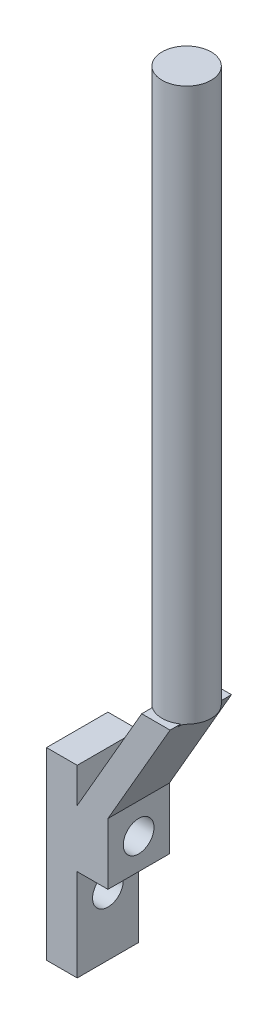
ISO-10303-21;
HEADER;
FILE_DESCRIPTION(('STEP AP214'),'2;1');
FILE_NAME('part.step','',(''),(''),'','','');
FILE_SCHEMA(('AUTOMOTIVE_DESIGN { 1 0 10303 214 1 1 1 1 }'));
ENDSEC;
DATA;
#1=APPLICATION_CONTEXT('core data for automotive mechanical design processes');
#2=APPLICATION_PROTOCOL_DEFINITION('international standard','automotive_design',2000,#1);
#3=PRODUCT_CONTEXT('',#1,'mechanical');
#4=PRODUCT('Part','Part','',(#3));
#5=PRODUCT_RELATED_PRODUCT_CATEGORY('part','',(#4));
#6=PRODUCT_DEFINITION_FORMATION('','',#4);
#7=PRODUCT_DEFINITION_CONTEXT('part definition',#1,'design');
#8=PRODUCT_DEFINITION('design','',#6,#7);
#9=PRODUCT_DEFINITION_SHAPE('','',#8);
#10=(LENGTH_UNIT() NAMED_UNIT(*) SI_UNIT(.MILLI.,.METRE.));
#11=(NAMED_UNIT(*) PLANE_ANGLE_UNIT() SI_UNIT($,.RADIAN.));
#12=(NAMED_UNIT(*) SI_UNIT($,.STERADIAN.) SOLID_ANGLE_UNIT());
#13=UNCERTAINTY_MEASURE_WITH_UNIT(LENGTH_MEASURE(1.E-05),#10,'distance_accuracy_value','');
#14=(GEOMETRIC_REPRESENTATION_CONTEXT(3) GLOBAL_UNCERTAINTY_ASSIGNED_CONTEXT((#13)) GLOBAL_UNIT_ASSIGNED_CONTEXT((#10,
#11,#12)) REPRESENTATION_CONTEXT('',''));
#15=CARTESIAN_POINT('',(0.,0.,0.));
#16=DIRECTION('',(0.,0.,1.));
#17=DIRECTION('',(1.,0.,0.));
#18=AXIS2_PLACEMENT_3D('',#15,#16,#17);
#19=CARTESIAN_POINT('',(7.81331403584307,27.5215173757844,10.));
#20=DIRECTION('',(0.,-1.,0.));
#21=DIRECTION('',(0.,0.,-1.));
#22=AXIS2_PLACEMENT_3D('',#19,#20,#21);
#23=PLANE('',#22);
#24=CARTESIAN_POINT('',(10.1227151126016,27.5215173757844,5.));
#25=DIRECTION('',(0.,1.,0.));
#26=DIRECTION('',(0.,0.,1.));
#27=AXIS2_PLACEMENT_3D('',#24,#25,#26);
#28=CIRCLE('',#27,4.);
#29=CARTESIAN_POINT('',(12.4321161893601,27.5215173757844,1.7340136762891));
#30=VERTEX_POINT('',#29);
#31=CARTESIAN_POINT('',(7.81331403584307,27.5215173757844,1.7340136762891));
#32=VERTEX_POINT('',#31);
#33=EDGE_CURVE('E163',#30,#32,#28,.T.);
#34=ORIENTED_EDGE('',*,*,#33,.F.);
#35=DIRECTION('',(0.,0.,-1.));
#36=VECTOR('',#35,1.);
#37=CARTESIAN_POINT('',(12.4321161893601,27.5215173757844,10.));
#38=LINE('',#37,#36);
#39=CARTESIAN_POINT('',(12.4321161893601,27.5215173757844,0.));
#40=VERTEX_POINT('',#39);
#41=EDGE_CURVE('E160',#30,#40,#38,.T.);
#42=ORIENTED_EDGE('',*,*,#41,.T.);
#43=DIRECTION('',(-1.,0.,0.));
#44=VECTOR('',#43,1.);
#45=CARTESIAN_POINT('',(7.81331403584307,27.5215173757844,0.));
#46=LINE('',#45,#44);
#47=CARTESIAN_POINT('',(7.81331403584307,27.5215173757844,0.));
#48=VERTEX_POINT('',#47);
#49=EDGE_CURVE('E233',#40,#48,#46,.T.);
#50=ORIENTED_EDGE('',*,*,#49,.T.);
#51=DIRECTION('',(0.,0.,-1.));
#52=VECTOR('',#51,1.);
#53=CARTESIAN_POINT('',(7.81331403584307,27.5215173757844,10.));
#54=LINE('',#53,#52);
#55=EDGE_CURVE('E239',#32,#48,#54,.T.);
#56=ORIENTED_EDGE('',*,*,#55,.F.);
#57=EDGE_LOOP('',(#34,#42,#50,#56));
#58=FACE_BOUND('',#57,.T.);
#59=ADVANCED_FACE('F33',(#58),#23,.F.);
#60=CARTESIAN_POINT('',(-2.68949008362502,9.3301270189221,10.));
#61=DIRECTION('',(-1.,0.,0.));
#62=DIRECTION('',(0.,0.,1.));
#63=AXIS2_PLACEMENT_3D('',#60,#61,#62);
#64=PLANE('',#63);
#65=DIRECTION('',(0.,1.,0.));
#66=VECTOR('',#65,1.);
#67=CARTESIAN_POINT('',(-2.68949008362502,9.3301270189221,0.));
#68=LINE('',#67,#66);
#69=CARTESIAN_POINT('',(-2.68949008362502,9.3301270189221,0.));
#70=VERTEX_POINT('',#69);
#71=CARTESIAN_POINT('',(-2.68949008362502,15.,0.));
#72=VERTEX_POINT('',#71);
#73=EDGE_CURVE('E191',#70,#72,#68,.T.);
#74=ORIENTED_EDGE('',*,*,#73,.T.);
#75=DIRECTION('',(0.,0.,-1.));
#76=VECTOR('',#75,1.);
#77=CARTESIAN_POINT('',(-2.68949008362502,15.,10.));
#78=LINE('',#77,#76);
#79=CARTESIAN_POINT('',(-2.68949008362502,15.,10.));
#80=VERTEX_POINT('',#79);
#81=EDGE_CURVE('E164',#80,#72,#78,.T.);
#82=ORIENTED_EDGE('',*,*,#81,.F.);
#83=DIRECTION('',(0.,1.,0.));
#84=VECTOR('',#83,1.);
#85=CARTESIAN_POINT('',(-2.68949008362502,9.3301270189221,10.));
#86=LINE('',#85,#84);
#87=CARTESIAN_POINT('',(-2.68949008362502,9.3301270189221,10.));
#88=VERTEX_POINT('',#87);
#89=EDGE_CURVE('E194',#88,#80,#86,.T.);
#90=ORIENTED_EDGE('',*,*,#89,.F.);
#91=DIRECTION('',(0.,0.,-1.));
#92=VECTOR('',#91,1.);
#93=CARTESIAN_POINT('',(-2.68949008362502,9.3301270189221,10.));
#94=LINE('',#93,#92);
#95=EDGE_CURVE('E215',#88,#70,#94,.T.);
#96=ORIENTED_EDGE('',*,*,#95,.T.);
#97=EDGE_LOOP('',(#74,#82,#90,#96));
#98=FACE_BOUND('',#97,.T.);
#99=ADVANCED_FACE('F285',(#98),#64,.F.);
#100=CARTESIAN_POINT('',(-7.68949008362502,15.,10.));
#101=DIRECTION('',(0.,-1.,0.));
#102=DIRECTION('',(0.,0.,-1.));
#103=AXIS2_PLACEMENT_3D('',#100,#101,#102);
#104=PLANE('',#103);
#105=DIRECTION('',(-1.,0.,0.));
#106=VECTOR('',#105,1.);
#107=CARTESIAN_POINT('',(-7.68949008362502,15.,0.));
#108=LINE('',#107,#106);
#109=CARTESIAN_POINT('',(-7.68949008362502,15.,0.));
#110=VERTEX_POINT('',#109);
#111=EDGE_CURVE('E218',#72,#110,#108,.T.);
#112=ORIENTED_EDGE('',*,*,#111,.T.);
#113=DIRECTION('',(0.,0.,-1.));
#114=VECTOR('',#113,1.);
#115=CARTESIAN_POINT('',(-7.68949008362502,15.,10.));
#116=LINE('',#115,#114);
#117=CARTESIAN_POINT('',(-7.68949008362502,15.,10.));
#118=VERTEX_POINT('',#117);
#119=EDGE_CURVE('E169',#118,#110,#116,.T.);
#120=ORIENTED_EDGE('',*,*,#119,.F.);
#121=DIRECTION('',(-1.,0.,0.));
#122=VECTOR('',#121,1.);
#123=CARTESIAN_POINT('',(-7.68949008362502,15.,10.));
#124=LINE('',#123,#122);
#125=EDGE_CURVE('E197',#80,#118,#124,.T.);
#126=ORIENTED_EDGE('',*,*,#125,.F.);
#127=ORIENTED_EDGE('',*,*,#81,.T.);
#128=EDGE_LOOP('',(#112,#120,#126,#127));
#129=FACE_BOUND('',#128,.T.);
#130=ADVANCED_FACE('F289',(#129),#104,.F.);
#131=CARTESIAN_POINT('',(-7.68949008362502,-15.,10.));
#132=DIRECTION('',(1.,0.,0.));
#133=DIRECTION('',(0.,0.,-1.));
#134=AXIS2_PLACEMENT_3D('',#131,#132,#133);
#135=PLANE('',#134);
#136=CARTESIAN_POINT('',(-7.68949008362502,-5.,5.));
#137=DIRECTION('',(-1.,0.,0.));
#138=DIRECTION('',(0.,0.,1.));
#139=AXIS2_PLACEMENT_3D('',#136,#137,#138);
#140=CIRCLE('',#139,2.5);
#141=CARTESIAN_POINT('',(-7.68949008362502,-5.,7.5));
#142=VERTEX_POINT('',#141);
#143=EDGE_CURVE('E177',#142,#142,#140,.T.);
#144=ORIENTED_EDGE('',*,*,#143,.F.);
#145=EDGE_LOOP('',(#144));
#146=FACE_BOUND('',#145,.T.);
#147=CARTESIAN_POINT('',(-7.68949008362502,5.,5.));
#148=DIRECTION('',(-1.,0.,0.));
#149=DIRECTION('',(0.,0.,1.));
#150=AXIS2_PLACEMENT_3D('',#147,#148,#149);
#151=CIRCLE('',#150,2.5);
#152=CARTESIAN_POINT('',(-7.68949008362502,5.,7.5));
#153=VERTEX_POINT('',#152);
#154=EDGE_CURVE('E185',#153,#153,#151,.T.);
#155=ORIENTED_EDGE('',*,*,#154,.F.);
#156=EDGE_LOOP('',(#155));
#157=FACE_BOUND('',#156,.T.);
#158=DIRECTION('',(0.,-1.,0.));
#159=VECTOR('',#158,1.);
#160=CARTESIAN_POINT('',(-7.68949008362502,-15.,0.));
#161=LINE('',#160,#159);
#162=CARTESIAN_POINT('',(-7.68949008362502,-15.,0.));
#163=VERTEX_POINT('',#162);
#164=EDGE_CURVE('E220',#110,#163,#161,.T.);
#165=ORIENTED_EDGE('',*,*,#164,.T.);
#166=DIRECTION('',(0.,0.,-1.));
#167=VECTOR('',#166,1.);
#168=CARTESIAN_POINT('',(-7.68949008362502,-15.,10.));
#169=LINE('',#168,#167);
#170=CARTESIAN_POINT('',(-7.68949008362502,-15.,10.));
#171=VERTEX_POINT('',#170);
#172=EDGE_CURVE('E253',#171,#163,#169,.T.);
#173=ORIENTED_EDGE('',*,*,#172,.F.);
#174=DIRECTION('',(0.,-1.,0.));
#175=VECTOR('',#174,1.);
#176=CARTESIAN_POINT('',(-7.68949008362502,-15.,10.));
#177=LINE('',#176,#175);
#178=EDGE_CURVE('E200',#118,#171,#177,.T.);
#179=ORIENTED_EDGE('',*,*,#178,.F.);
#180=ORIENTED_EDGE('',*,*,#119,.T.);
#181=EDGE_LOOP('',(#165,#173,#179,#180));
#182=FACE_BOUND('',#181,.T.);
#183=ADVANCED_FACE('F293',(#146,#157,#182),#135,.F.);
#184=CARTESIAN_POINT('',(-7.68949008362502,-15.,10.));
#185=DIRECTION('',(0.,1.,0.));
#186=DIRECTION('',(0.,0.,1.));
#187=AXIS2_PLACEMENT_3D('',#184,#185,#186);
#188=PLANE('',#187);
#189=DIRECTION('',(1.,0.,0.));
#190=VECTOR('',#189,1.);
#191=CARTESIAN_POINT('',(-7.68949008362502,-15.,0.));
#192=LINE('',#191,#190);
#193=CARTESIAN_POINT('',(-2.68949008362502,-15.,0.));
#194=VERTEX_POINT('',#193);
#195=EDGE_CURVE('E222',#163,#194,#192,.T.);
#196=ORIENTED_EDGE('',*,*,#195,.T.);
#197=DIRECTION('',(0.,0.,-1.));
#198=VECTOR('',#197,1.);
#199=CARTESIAN_POINT('',(-2.68949008362502,-15.,10.));
#200=LINE('',#199,#198);
#201=CARTESIAN_POINT('',(-2.68949008362502,-15.,10.));
#202=VERTEX_POINT('',#201);
#203=EDGE_CURVE('E250',#202,#194,#200,.T.);
#204=ORIENTED_EDGE('',*,*,#203,.F.);
#205=DIRECTION('',(1.,0.,0.));
#206=VECTOR('',#205,1.);
#207=CARTESIAN_POINT('',(-7.68949008362502,-15.,10.));
#208=LINE('',#207,#206);
#209=EDGE_CURVE('E202',#171,#202,#208,.T.);
#210=ORIENTED_EDGE('',*,*,#209,.F.);
#211=ORIENTED_EDGE('',*,*,#172,.T.);
#212=EDGE_LOOP('',(#196,#204,#210,#211));
#213=FACE_BOUND('',#212,.T.);
#214=ADVANCED_FACE('F297',(#213),#188,.F.);
#215=CARTESIAN_POINT('',(-2.68949008362502,-15.,10.));
#216=DIRECTION('',(-1.,0.,0.));
#217=DIRECTION('',(0.,-1.,0.));
#218=AXIS2_PLACEMENT_3D('',#215,#216,#217);
#219=PLANE('',#218);
#220=CARTESIAN_POINT('',(-2.68949008362502,-5.,5.));
#221=DIRECTION('',(-1.,0.,0.));
#222=DIRECTION('',(0.,-1.,0.));
#223=AXIS2_PLACEMENT_3D('',#220,#221,#222);
#224=CIRCLE('',#223,2.5);
#225=CARTESIAN_POINT('',(-2.68949008362502,-7.5,5.));
#226=VERTEX_POINT('',#225);
#227=EDGE_CURVE('E181',#226,#226,#224,.T.);
#228=ORIENTED_EDGE('',*,*,#227,.T.);
#229=EDGE_LOOP('',(#228));
#230=FACE_BOUND('',#229,.T.);
#231=DIRECTION('',(0.,1.,0.));
#232=VECTOR('',#231,1.);
#233=CARTESIAN_POINT('',(-2.68949008362502,-15.,0.));
#234=LINE('',#233,#232);
#235=CARTESIAN_POINT('',(-2.68949008362502,0.,0.));
#236=VERTEX_POINT('',#235);
#237=EDGE_CURVE('E224',#194,#236,#234,.T.);
#238=ORIENTED_EDGE('',*,*,#237,.T.);
#239=DIRECTION('',(0.,0.,-1.));
#240=VECTOR('',#239,1.);
#241=CARTESIAN_POINT('',(-2.68949008362502,0.,10.));
#242=LINE('',#241,#240);
#243=CARTESIAN_POINT('',(-2.68949008362502,0.,10.));
#244=VERTEX_POINT('',#243);
#245=EDGE_CURVE('E247',#244,#236,#242,.T.);
#246=ORIENTED_EDGE('',*,*,#245,.F.);
#247=DIRECTION('',(0.,1.,0.));
#248=VECTOR('',#247,1.);
#249=CARTESIAN_POINT('',(-2.68949008362502,-15.,10.));
#250=LINE('',#249,#248);
#251=EDGE_CURVE('E204',#202,#244,#250,.T.);
#252=ORIENTED_EDGE('',*,*,#251,.F.);
#253=ORIENTED_EDGE('',*,*,#203,.T.);
#254=EDGE_LOOP('',(#238,#246,#252,#253));
#255=FACE_BOUND('',#254,.T.);
#256=ADVANCED_FACE('F301',(#230,#255),#219,.F.);
#257=CARTESIAN_POINT('',(-2.68949008362502,0.,10.));
#258=DIRECTION('',(0.,1.,0.));
#259=DIRECTION('',(-1.,0.,0.));
#260=AXIS2_PLACEMENT_3D('',#257,#258,#259);
#261=PLANE('',#260);
#262=DIRECTION('',(1.,0.,0.));
#263=VECTOR('',#262,1.);
#264=CARTESIAN_POINT('',(-2.68949008362502,0.,0.));
#265=LINE('',#264,#263);
#266=CARTESIAN_POINT('',(2.31050991637498,0.,0.));
#267=VERTEX_POINT('',#266);
#268=EDGE_CURVE('E226',#236,#267,#265,.T.);
#269=ORIENTED_EDGE('',*,*,#268,.T.);
#270=DIRECTION('',(0.,0.,-1.));
#271=VECTOR('',#270,1.);
#272=CARTESIAN_POINT('',(2.31050991637498,0.,10.));
#273=LINE('',#272,#271);
#274=CARTESIAN_POINT('',(2.31050991637498,0.,10.));
#275=VERTEX_POINT('',#274);
#276=EDGE_CURVE('E244',#275,#267,#273,.T.);
#277=ORIENTED_EDGE('',*,*,#276,.F.);
#278=DIRECTION('',(1.,0.,0.));
#279=VECTOR('',#278,1.);
#280=CARTESIAN_POINT('',(-2.68949008362502,0.,10.));
#281=LINE('',#280,#279);
#282=EDGE_CURVE('E206',#244,#275,#281,.T.);
#283=ORIENTED_EDGE('',*,*,#282,.F.);
#284=ORIENTED_EDGE('',*,*,#245,.T.);
#285=EDGE_LOOP('',(#269,#277,#283,#284));
#286=FACE_BOUND('',#285,.T.);
#287=ADVANCED_FACE('F305',(#286),#261,.F.);
#288=CARTESIAN_POINT('',(2.31050991637498,0.,10.));
#289=DIRECTION('',(-1.,0.,0.));
#290=DIRECTION('',(0.,0.,1.));
#291=AXIS2_PLACEMENT_3D('',#288,#289,#290);
#292=PLANE('',#291);
#293=CARTESIAN_POINT('',(2.31050991637498,5.,5.));
#294=DIRECTION('',(-1.,0.,0.));
#295=DIRECTION('',(0.,0.,1.));
#296=AXIS2_PLACEMENT_3D('',#293,#294,#295);
#297=CIRCLE('',#296,2.5);
#298=CARTESIAN_POINT('',(2.31050991637498,5.,7.5));
#299=VERTEX_POINT('',#298);
#300=EDGE_CURVE('E188',#299,#299,#297,.T.);
#301=ORIENTED_EDGE('',*,*,#300,.T.);
#302=EDGE_LOOP('',(#301));
#303=FACE_BOUND('',#302,.T.);
#304=DIRECTION('',(0.,1.,0.));
#305=VECTOR('',#304,1.);
#306=CARTESIAN_POINT('',(2.31050991637498,0.,0.));
#307=LINE('',#306,#305);
#308=CARTESIAN_POINT('',(2.31050991637498,9.99038105676646,0.));
#309=VERTEX_POINT('',#308);
#310=EDGE_CURVE('E228',#267,#309,#307,.T.);
#311=ORIENTED_EDGE('',*,*,#310,.T.);
#312=DIRECTION('',(0.,0.,-1.));
#313=VECTOR('',#312,1.);
#314=CARTESIAN_POINT('',(2.31050991637498,9.99038105676646,10.));
#315=LINE('',#314,#313);
#316=CARTESIAN_POINT('',(2.31050991637498,9.99038105676646,10.));
#317=VERTEX_POINT('',#316);
#318=EDGE_CURVE('E159',#317,#309,#315,.T.);
#319=ORIENTED_EDGE('',*,*,#318,.F.);
#320=DIRECTION('',(0.,1.,0.));
#321=VECTOR('',#320,1.);
#322=CARTESIAN_POINT('',(2.31050991637498,0.,10.));
#323=LINE('',#322,#321);
#324=EDGE_CURVE('E208',#275,#317,#323,.T.);
#325=ORIENTED_EDGE('',*,*,#324,.F.);
#326=ORIENTED_EDGE('',*,*,#276,.T.);
#327=EDGE_LOOP('',(#311,#319,#325,#326));
#328=FACE_BOUND('',#327,.T.);
#329=ADVANCED_FACE('F309',(#303,#328),#292,.F.);
#330=CARTESIAN_POINT('',(2.31050991637498,9.99038105676646,10.));
#331=DIRECTION('',(-0.866025403784436,0.500000000000004,0.));
#332=DIRECTION('',(-0.500000000000004,-0.866025403784436,0.));
#333=AXIS2_PLACEMENT_3D('',#330,#331,#332);
#334=PLANE('',#333);
#335=ORIENTED_EDGE('',*,*,#41,.F.);
#336=CARTESIAN_POINT('',(10.1227151126016,23.5215173757844,5.));
#337=DIRECTION('',(-0.866025403784436,0.500000000000004,0.));
#338=DIRECTION('',(-0.500000000000004,-0.866025403784436,0.));
#339=AXIS2_PLACEMENT_3D('',#336,#337,#338);
#340=ELLIPSE('',#339,7.99999999999994,4.);
#341=CARTESIAN_POINT('',(12.1434410547653,27.0215173757844,1.54794747046534));
#342=VERTEX_POINT('',#341);
#343=EDGE_CURVE('E261',#30,#342,#340,.T.);
#344=ORIENTED_EDGE('',*,*,#343,.T.);
#345=DIRECTION('',(0.,0.,-1.));
#346=VECTOR('',#345,1.);
#347=CARTESIAN_POINT('',(12.1434410547653,27.0215173757844,8.2659863237109));
#348=LINE('',#347,#346);
#349=CARTESIAN_POINT('',(12.1434410547653,27.0215173757844,8.45205252953466));
#350=VERTEX_POINT('',#349);
#351=EDGE_CURVE('E149',#342,#350,#348,.F.);
#352=ORIENTED_EDGE('',*,*,#351,.T.);
#353=CARTESIAN_POINT('',(10.1227151126016,23.5215173757844,5.));
#354=DIRECTION('',(-0.866025403784436,0.500000000000004,0.));
#355=DIRECTION('',(-0.500000000000004,-0.866025403784436,0.));
#356=AXIS2_PLACEMENT_3D('',#353,#354,#355);
#357=ELLIPSE('',#356,7.99999999999994,4.);
#358=CARTESIAN_POINT('',(12.4321161893601,27.5215173757844,8.2659863237109));
#359=VERTEX_POINT('',#358);
#360=EDGE_CURVE('E140',#350,#359,#357,.T.);
#361=ORIENTED_EDGE('',*,*,#360,.T.);
#362=CARTESIAN_POINT('',(12.4321161893601,27.5215173757844,10.));
#363=VERTEX_POINT('',#362);
#364=EDGE_CURVE('E145',#363,#359,#38,.T.);
#365=ORIENTED_EDGE('',*,*,#364,.F.);
#366=DIRECTION('',(0.500000000000004,0.866025403784436,0.));
#367=VECTOR('',#366,1.);
#368=CARTESIAN_POINT('',(2.31050991637498,9.99038105676646,10.));
#369=LINE('',#368,#367);
#370=EDGE_CURVE('E210',#317,#363,#369,.T.);
#371=ORIENTED_EDGE('',*,*,#370,.F.);
#372=ORIENTED_EDGE('',*,*,#318,.T.);
#373=DIRECTION('',(0.500000000000004,0.866025403784436,0.));
#374=VECTOR('',#373,1.);
#375=CARTESIAN_POINT('',(2.31050991637498,9.99038105676646,0.));
#376=LINE('',#375,#374);
#377=EDGE_CURVE('E230',#309,#40,#376,.T.);
#378=ORIENTED_EDGE('',*,*,#377,.T.);
#379=EDGE_LOOP('',(#335,#344,#352,#361,#365,#371,#372,#378));
#380=FACE_BOUND('',#379,.T.);
#381=ADVANCED_FACE('F143',(#380),#334,.F.);
#382=CARTESIAN_POINT('',(7.81331403584307,27.5215173757844,8.2659863237109));
#383=VERTEX_POINT('',#382);
#384=EDGE_CURVE('E157',#383,#359,#28,.T.);
#385=ORIENTED_EDGE('',*,*,#384,.F.);
#386=CARTESIAN_POINT('',(7.81331403584307,27.5215173757844,10.));
#387=VERTEX_POINT('',#386);
#388=EDGE_CURVE('E240',#387,#383,#54,.T.);
#389=ORIENTED_EDGE('',*,*,#388,.F.);
#390=DIRECTION('',(-1.,0.,0.));
#391=VECTOR('',#390,1.);
#392=CARTESIAN_POINT('',(7.81331403584307,27.5215173757844,10.));
#393=LINE('',#392,#391);
#394=EDGE_CURVE('E158',#363,#387,#393,.T.);
#395=ORIENTED_EDGE('',*,*,#394,.F.);
#396=ORIENTED_EDGE('',*,*,#364,.T.);
#397=EDGE_LOOP('',(#385,#389,#395,#396));
#398=FACE_BOUND('',#397,.T.);
#399=ADVANCED_FACE('F155',(#398),#23,.F.);
#400=CARTESIAN_POINT('',(-2.68949008362502,9.3301270189221,10.));
#401=DIRECTION('',(0.866025403784437,-0.500000000000004,0.));
#402=DIRECTION('',(0.500000000000004,0.866025403784437,0.));
#403=AXIS2_PLACEMENT_3D('',#400,#401,#402);
#404=PLANE('',#403);
#405=DIRECTION('',(0.,0.,-1.));
#406=VECTOR('',#405,1.);
#407=CARTESIAN_POINT('',(6.94728863205862,26.0215173757844,1.7340136762891));
#408=LINE('',#407,#406);
#409=CARTESIAN_POINT('',(6.94728863205862,26.0215173757844,7.43241991988987));
#410=VERTEX_POINT('',#409);
#411=CARTESIAN_POINT('',(6.94728863205862,26.0215173757844,2.56758008011013));
#412=VERTEX_POINT('',#411);
#413=EDGE_CURVE('E264',#410,#412,#408,.T.);
#414=ORIENTED_EDGE('',*,*,#413,.T.);
#415=CARTESIAN_POINT('',(10.1227151126016,31.5215173757843,5.));
#416=DIRECTION('',(0.866025403784437,-0.500000000000004,0.));
#417=DIRECTION('',(-0.500000000000004,-0.866025403784437,0.));
#418=AXIS2_PLACEMENT_3D('',#415,#416,#417);
#419=ELLIPSE('',#418,7.99999999999994,4.);
#420=EDGE_CURVE('E267',#412,#32,#419,.T.);
#421=ORIENTED_EDGE('',*,*,#420,.T.);
#422=ORIENTED_EDGE('',*,*,#55,.T.);
#423=DIRECTION('',(-0.500000000000004,-0.866025403784436,0.));
#424=VECTOR('',#423,1.);
#425=CARTESIAN_POINT('',(-2.68949008362502,9.3301270189221,0.));
#426=LINE('',#425,#424);
#427=EDGE_CURVE('E198',#48,#70,#426,.T.);
#428=ORIENTED_EDGE('',*,*,#427,.T.);
#429=ORIENTED_EDGE('',*,*,#95,.F.);
#430=DIRECTION('',(-0.500000000000004,-0.866025403784436,0.));
#431=VECTOR('',#430,1.);
#432=CARTESIAN_POINT('',(-2.68949008362502,9.3301270189221,10.));
#433=LINE('',#432,#431);
#434=EDGE_CURVE('E213',#387,#88,#433,.T.);
#435=ORIENTED_EDGE('',*,*,#434,.F.);
#436=ORIENTED_EDGE('',*,*,#388,.T.);
#437=CARTESIAN_POINT('',(10.1227151126016,31.5215173757843,5.));
#438=DIRECTION('',(0.866025403784437,-0.500000000000004,0.));
#439=DIRECTION('',(-0.500000000000004,-0.866025403784437,0.));
#440=AXIS2_PLACEMENT_3D('',#437,#438,#439);
#441=ELLIPSE('',#440,7.99999999999994,4.);
#442=EDGE_CURVE('E53',#383,#410,#441,.T.);
#443=ORIENTED_EDGE('',*,*,#442,.T.);
#444=EDGE_LOOP('',(#414,#421,#422,#428,#429,#435,#436,#443));
#445=FACE_BOUND('',#444,.T.);
#446=ADVANCED_FACE('F318',(#445),#404,.F.);
#447=CARTESIAN_POINT('',(0.,0.,10.));
#448=DIRECTION('',(0.,0.,-1.));
#449=DIRECTION('',(-1.,0.,0.));
#450=AXIS2_PLACEMENT_3D('',#447,#448,#449);
#451=PLANE('',#450);
#452=ORIENTED_EDGE('',*,*,#89,.T.);
#453=ORIENTED_EDGE('',*,*,#125,.T.);
#454=ORIENTED_EDGE('',*,*,#178,.T.);
#455=ORIENTED_EDGE('',*,*,#209,.T.);
#456=ORIENTED_EDGE('',*,*,#251,.T.);
#457=ORIENTED_EDGE('',*,*,#282,.T.);
#458=ORIENTED_EDGE('',*,*,#324,.T.);
#459=ORIENTED_EDGE('',*,*,#370,.T.);
#460=ORIENTED_EDGE('',*,*,#394,.T.);
#461=ORIENTED_EDGE('',*,*,#434,.T.);
#462=EDGE_LOOP('',(#452,#453,#454,#455,#456,#457,#458,#459,#460,#461));
#463=FACE_BOUND('',#462,.T.);
#464=ADVANCED_FACE('F321',(#463),#451,.F.);
#465=CARTESIAN_POINT('',(0.,0.,0.));
#466=DIRECTION('',(0.,0.,-1.));
#467=DIRECTION('',(-1.,0.,0.));
#468=AXIS2_PLACEMENT_3D('',#465,#466,#467);
#469=PLANE('',#468);
#470=ORIENTED_EDGE('',*,*,#73,.F.);
#471=ORIENTED_EDGE('',*,*,#427,.F.);
#472=ORIENTED_EDGE('',*,*,#49,.F.);
#473=ORIENTED_EDGE('',*,*,#377,.F.);
#474=ORIENTED_EDGE('',*,*,#310,.F.);
#475=ORIENTED_EDGE('',*,*,#268,.F.);
#476=ORIENTED_EDGE('',*,*,#237,.F.);
#477=ORIENTED_EDGE('',*,*,#195,.F.);
#478=ORIENTED_EDGE('',*,*,#164,.F.);
#479=ORIENTED_EDGE('',*,*,#111,.F.);
#480=EDGE_LOOP('',(#470,#471,#472,#473,#474,#475,#476,#477,#478,#479));
#481=FACE_BOUND('',#480,.T.);
#482=ADVANCED_FACE('F323',(#481),#469,.T.);
#483=CARTESIAN_POINT('',(2.31050991637498,5.,5.));
#484=DIRECTION('',(-1.,0.,0.));
#485=DIRECTION('',(0.,0.,1.));
#486=AXIS2_PLACEMENT_3D('',#483,#484,#485);
#487=CYLINDRICAL_SURFACE('',#486,2.5);
#488=ORIENTED_EDGE('',*,*,#300,.F.);
#489=EDGE_LOOP('',(#488));
#490=FACE_BOUND('',#489,.T.);
#491=ORIENTED_EDGE('',*,*,#154,.T.);
#492=EDGE_LOOP('',(#491));
#493=FACE_BOUND('',#492,.T.);
#494=ADVANCED_FACE('F326',(#490,#493),#487,.F.);
#495=CARTESIAN_POINT('',(2.31050991637498,-5.,5.));
#496=DIRECTION('',(-1.,0.,0.));
#497=DIRECTION('',(0.,0.,1.));
#498=AXIS2_PLACEMENT_3D('',#495,#496,#497);
#499=CYLINDRICAL_SURFACE('',#498,2.5);
#500=ORIENTED_EDGE('',*,*,#143,.T.);
#501=EDGE_LOOP('',(#500));
#502=FACE_BOUND('',#501,.T.);
#503=ORIENTED_EDGE('',*,*,#227,.F.);
#504=EDGE_LOOP('',(#503));
#505=FACE_BOUND('',#504,.T.);
#506=ADVANCED_FACE('F332',(#502,#505),#499,.F.);
#507=CARTESIAN_POINT('',(10.1227151126016,27.5215173757844,5.));
#508=DIRECTION('',(0.,1.,0.));
#509=DIRECTION('',(0.,0.,1.));
#510=AXIS2_PLACEMENT_3D('',#507,#508,#509);
#511=PLANE('',#510);
#512=CARTESIAN_POINT('',(13.0094664585497,27.5215173757844,7.76887462097269));
#513=VERTEX_POINT('',#512);
#514=CARTESIAN_POINT('',(13.0094664585497,27.5215173757844,2.23112537902731));
#515=VERTEX_POINT('',#514);
#516=EDGE_CURVE('E166',#513,#515,#28,.T.);
#517=ORIENTED_EDGE('',*,*,#516,.F.);
#518=DIRECTION('',(0.,0.,-1.));
#519=VECTOR('',#518,1.);
#520=CARTESIAN_POINT('',(13.0094664585497,27.5215173757844,1.7340136762891));
#521=LINE('',#520,#519);
#522=EDGE_CURVE('E151',#513,#515,#521,.T.);
#523=ORIENTED_EDGE('',*,*,#522,.T.);
#524=EDGE_LOOP('',(#517,#523));
#525=FACE_BOUND('',#524,.T.);
#526=ADVANCED_FACE('F335',(#525),#511,.F.);
#527=CARTESIAN_POINT('',(10.1227151126016,117.521517375784,5.));
#528=DIRECTION('',(0.,-1.,0.));
#529=DIRECTION('',(0.,0.,-1.));
#530=AXIS2_PLACEMENT_3D('',#527,#528,#529);
#531=CYLINDRICAL_SURFACE('',#530,4.);
#532=CARTESIAN_POINT('',(10.1227151126016,117.521517375784,5.));
#533=DIRECTION('',(0.,1.,0.));
#534=DIRECTION('',(0.,0.,1.));
#535=AXIS2_PLACEMENT_3D('',#532,#533,#534);
#536=CIRCLE('',#535,4.);
#537=CARTESIAN_POINT('',(10.1227151126016,117.521517375784,9.));
#538=VERTEX_POINT('',#537);
#539=EDGE_CURVE('E174',#538,#538,#536,.T.);
#540=ORIENTED_EDGE('',*,*,#539,.F.);
#541=EDGE_LOOP('',(#540));
#542=FACE_BOUND('',#541,.T.);
#543=ORIENTED_EDGE('',*,*,#384,.T.);
#544=ORIENTED_EDGE('',*,*,#360,.F.);
#545=CARTESIAN_POINT('',(12.1434410547653,27.0215173757844,8.45205252953466));
#546=CARTESIAN_POINT('',(12.1574265091564,27.0457451607551,8.44386550689673));
#547=CARTESIAN_POINT('',(12.1723272677514,27.0692009009897,8.43502912714203));
#548=CARTESIAN_POINT('',(12.2037364178457,27.1144392553982,8.41609247570115));
#549=CARTESIAN_POINT('',(12.2202435450016,27.1362231616685,8.40599319626405));
#550=CARTESIAN_POINT('',(12.271595269201,27.1985883809706,8.37400709732685));
#551=CARTESIAN_POINT('',(12.3085049372632,27.236580964353,8.35029766804766));
#552=CARTESIAN_POINT('',(12.385830825286,27.3049338033696,8.29855483027482));
#553=CARTESIAN_POINT('',(12.4262371374088,27.3353147319496,8.27053347484389));
#554=CARTESIAN_POINT('',(12.5090859265276,27.3887285573418,8.21058565691323));
#555=CARTESIAN_POINT('',(12.5515328400224,27.4117445261696,8.17865042809074));
#556=CARTESIAN_POINT('',(12.6547959948724,27.458872341472,8.09749334791811));
#557=CARTESIAN_POINT('',(12.7159107835974,27.4794597919391,8.04660542042779));
#558=CARTESIAN_POINT('',(12.8364291130488,27.5083862502609,7.93977159268448));
#559=CARTESIAN_POINT('',(12.89583243691,27.5167237125142,7.88382505512341));
#560=CARTESIAN_POINT('',(12.9723772501075,27.5210061514354,7.80716064394308));
#561=CARTESIAN_POINT('',(12.9910259593515,27.5215159022869,7.78810505431339));
#562=CARTESIAN_POINT('',(13.0094664585497,27.5215173757844,7.76887462097269));
#563=B_SPLINE_CURVE_WITH_KNOTS('',3,(#545,#546,#547,#548,#549,#550,#551,#552,#553,#554,#555,
#556,#557,#558,#559,#560,#561,#562),.UNSPECIFIED.,.F.,.F.,(4,2,2,2,2,2,2,2,4),(0.,
0.087376227798189,0.174684231199718,0.347877843245191,0.520595840962135,0.693708017288107,
0.9388082887694,1.18393948230468,1.26390573665791),.UNSPECIFIED.);
#564=EDGE_CURVE('E47',#350,#513,#563,.T.);
#565=ORIENTED_EDGE('',*,*,#564,.T.);
#566=ORIENTED_EDGE('',*,*,#516,.T.);
#567=CARTESIAN_POINT('',(13.0094664585497,27.5215173757844,2.23112537902731));
#568=CARTESIAN_POINT('',(12.9803565182976,27.5215147566484,2.20076906175858));
#569=CARTESIAN_POINT('',(12.950748105717,27.5202454120074,2.17086545436409));
#570=CARTESIAN_POINT('',(12.8906842016572,27.5148971550645,2.11207580306969));
#571=CARTESIAN_POINT('',(12.8602272894886,27.5108132204048,2.08319167533969));
#572=CARTESIAN_POINT('',(12.7983937745905,27.4994976821612,2.02636138412036));
#573=CARTESIAN_POINT('',(12.7670108266036,27.492232961929,1.99842851509022));
#574=CARTESIAN_POINT('',(12.7039799597171,27.4742776592272,1.9440541040527));
#575=CARTESIAN_POINT('',(12.6723322563675,27.4635896410846,1.917611463124));
#576=CARTESIAN_POINT('',(12.5926415378861,27.4319721289715,1.85305314142006));
#577=CARTESIAN_POINT('',(12.5446392492292,27.4086075731844,1.81602595254712));
#578=CARTESIAN_POINT('',(12.4509612034486,27.352795826601,1.74690305910448));
#579=CARTESIAN_POINT('',(12.4052717678663,27.3204119149699,1.71477532690133));
#580=CARTESIAN_POINT('',(12.3202319943316,27.2480899229943,1.65733302675222));
#581=CARTESIAN_POINT('',(12.2806807411493,27.2085997494262,1.63176175287393));
#582=CARTESIAN_POINT('',(12.2256549322981,27.1431844138319,1.59733540962764));
#583=CARTESIAN_POINT('',(12.2079241749745,27.1201709686417,1.58645473269277));
#584=CARTESIAN_POINT('',(12.1742621308761,27.0722377573491,1.56611880689972));
#585=CARTESIAN_POINT('',(12.1583326434585,27.0473161260339,1.55666498027658));
#586=CARTESIAN_POINT('',(12.1434410547653,27.0215173757844,1.54794747046534));
#587=B_SPLINE_CURVE_WITH_KNOTS('',3,(#567,#568,#569,#570,#571,#572,#573,#574,#575,#576,#577,
#578,#579,#580,#581,#582,#583,#584,#585,#586),.UNSPECIFIED.,.F.,.F.,(4,2,2,2,2,2,2,2,2,4),(0.,
0.126177138724425,0.252580013028114,0.38033143965772,0.507987393067293,0.702091992139103,
0.894867660240151,1.0781973432905,1.17113667565658,1.26416804346763),.UNSPECIFIED.);
#588=EDGE_CURVE('E269',#515,#342,#587,.T.);
#589=ORIENTED_EDGE('',*,*,#588,.T.);
#590=ORIENTED_EDGE('',*,*,#343,.F.);
#591=ORIENTED_EDGE('',*,*,#33,.T.);
#592=ORIENTED_EDGE('',*,*,#420,.F.);
#593=CARTESIAN_POINT('',(6.94728863205862,26.0215173757844,2.56758008011013));
#594=CARTESIAN_POINT('',(6.96459753985227,26.0514419424899,2.54497647258402));
#595=CARTESIAN_POINT('',(6.98094859489622,26.0834049796567,2.52413992121628));
#596=CARTESIAN_POINT('',(7.01088289607147,26.151147874639,2.4866213794066));
#597=CARTESIAN_POINT('',(7.02444846153542,26.1869500433331,2.46996578733525));
#598=CARTESIAN_POINT('',(7.0477840291131,26.2619274029637,2.44165236806504));
#599=CARTESIAN_POINT('',(7.05753369209662,26.3011193447831,2.43002128880051));
#600=CARTESIAN_POINT('',(7.07225646605662,26.3815356570446,2.4125620562384));
#601=CARTESIAN_POINT('',(7.07724394984409,26.4227535145257,2.40671643977709));
#602=CARTESIAN_POINT('',(7.08182433861524,26.5026767737624,2.40134764264815));
#603=CARTESIAN_POINT('',(7.08180468340195,26.5413298987761,2.40137038505654));
#604=CARTESIAN_POINT('',(7.07733518827519,26.6180443157315,2.40660980100165));
#605=CARTESIAN_POINT('',(7.0728825453157,26.6561052177363,2.4118297608186));
#606=CARTESIAN_POINT('',(7.06020588951833,26.7288186090191,2.42684499311062));
#607=CARTESIAN_POINT('',(7.05215893130852,26.7635474042631,2.43642582994211));
#608=CARTESIAN_POINT('',(7.032917147773,26.8306705738961,2.45965050340475));
#609=CARTESIAN_POINT('',(7.02172203047729,26.8630647314133,2.47329471689292));
#610=CARTESIAN_POINT('',(6.9924890405757,26.9358793239855,2.50953950757317));
#611=CARTESIAN_POINT('',(6.9734262744138,26.9751605380098,2.53360417940692));
#612=CARTESIAN_POINT('',(6.93234632488356,27.0482276799221,2.58697564890434));
#613=CARTESIAN_POINT('',(6.91032361870239,27.0820030675817,2.6162922808388));
#614=CARTESIAN_POINT('',(6.85513802146114,27.1572179140247,2.6921986274131));
#615=CARTESIAN_POINT('',(6.82117265016513,27.1959420005977,2.7408799744065));
#616=CARTESIAN_POINT('',(6.75285276572844,27.2640157277054,2.84410496890558));
#617=CARTESIAN_POINT('',(6.71849764950752,27.2933479141334,2.89865928242722));
#618=CARTESIAN_POINT('',(6.65699974096258,27.3398936266322,3.00205414946319));
#619=CARTESIAN_POINT('',(6.62964302212251,27.3583280923352,3.05023474355191));
#620=CARTESIAN_POINT('',(6.57640207274895,27.3908921277109,3.14883681875351));
#621=CARTESIAN_POINT('',(6.55051883774213,27.4050188143557,3.19925977484291));
#622=CARTESIAN_POINT('',(6.50057746051301,27.4297870270707,3.30194623768731));
#623=CARTESIAN_POINT('',(6.47652301445466,27.440421632034,3.35421317488001));
#624=CARTESIAN_POINT('',(6.43052824566086,27.4588681709412,3.46016378286959));
#625=CARTESIAN_POINT('',(6.40858866501295,27.4666791167131,3.51384794260091));
#626=CARTESIAN_POINT('',(6.35218722150542,27.4848488584364,3.66097072597982));
#627=CARTESIAN_POINT('',(6.31992033557661,27.4930671872205,3.75552180403365));
#628=CARTESIAN_POINT('',(6.26249618119258,27.5053939455901,3.94704029105965));
#629=CARTESIAN_POINT('',(6.23734366151804,27.5094996346467,4.04400926719766));
#630=CARTESIAN_POINT('',(6.19434967797271,27.515339645601,4.23974020013631));
#631=CARTESIAN_POINT('',(6.17651693084343,27.5170711459063,4.33850414923156));
#632=CARTESIAN_POINT('',(6.14832756783465,27.519365936842,4.53707522288359));
#633=CARTESIAN_POINT('',(6.1379690591516,27.5199295233069,4.63688207683158));
#634=CARTESIAN_POINT('',(6.12448326758307,27.5206074233791,4.8415010339464));
#635=CARTESIAN_POINT('',(6.12170251885959,27.5207003690731,4.94633618986156));
#636=CARTESIAN_POINT('',(6.12438135893787,27.5205881594864,5.15592824563079));
#637=CARTESIAN_POINT('',(6.12984306461324,27.5203829276267,5.26068511846606));
#638=CARTESIAN_POINT('',(6.14894678684614,27.5192696709806,5.46913762353328));
#639=CARTESIAN_POINT('',(6.16256511146739,27.5183636794275,5.57283544810043));
#640=CARTESIAN_POINT('',(6.19787010819366,27.514855013115,5.77877609969852));
#641=CARTESIAN_POINT('',(6.21955153428929,27.5122534407069,5.88101982798465));
#642=CARTESIAN_POINT('',(6.25522203828602,27.5063216025911,6.02184883999164));
#643=CARTESIAN_POINT('',(6.26587844494371,27.5043950010392,6.06135960295578));
#644=CARTESIAN_POINT('',(6.28839949160792,27.4998971994947,6.14004369353897));
#645=CARTESIAN_POINT('',(6.30026536111069,27.4973253395962,6.17921663298102));
#646=CARTESIAN_POINT('',(6.33327089480352,27.4894738114679,6.28244438568054));
#647=CARTESIAN_POINT('',(6.35542687471478,27.4835205052513,6.34612895881009));
#648=CARTESIAN_POINT('',(6.4028210446487,27.468732918782,6.47204440694));
#649=CARTESIAN_POINT('',(6.42806073181099,27.4598972356311,6.53427455821281));
#650=CARTESIAN_POINT('',(6.48134936427277,27.4384447218795,6.65677678542794));
#651=CARTESIAN_POINT('',(6.50939470245693,27.425832705798,6.71705124690821));
#652=CARTESIAN_POINT('',(6.56790709508657,27.3957368572654,6.83512201134831));
#653=CARTESIAN_POINT('',(6.59837184740688,27.3782576173076,6.89292059140841));
#654=CARTESIAN_POINT('',(6.66069701030731,27.3373783871539,7.00461139045712));
#655=CARTESIAN_POINT('',(6.69253528916982,27.3140549189178,7.05854332324328));
#656=CARTESIAN_POINT('',(6.75688826900575,27.2599585563584,7.16215488949421));
#657=CARTESIAN_POINT('',(6.78940242689512,27.2291914466058,7.21183778457046));
#658=CARTESIAN_POINT('',(6.84817226143613,27.1645071997025,7.29774391085708));
#659=CARTESIAN_POINT('',(6.8745866703295,27.1319134517104,7.33484258921453));
#660=CARTESIAN_POINT('',(6.92512431545112,27.0598714234853,7.40358579053801));
#661=CARTESIAN_POINT('',(6.94925122759435,27.0204344389931,7.43523913298599));
#662=CARTESIAN_POINT('',(6.98782637023181,26.9451548536378,7.48459400060926));
#663=CARTESIAN_POINT('',(7.00319917336381,26.910787657242,7.50381482231978));
#664=CARTESIAN_POINT('',(7.03048701077068,26.8384774232651,7.53743859008195));
#665=CARTESIAN_POINT('',(7.04240382293295,26.8005362376305,7.55184401393361));
#666=CARTESIAN_POINT('',(7.06189052605948,26.7215992437539,7.57518731224371));
#667=CARTESIAN_POINT('',(7.06942833081301,26.6805833144564,7.58408485929376));
#668=CARTESIAN_POINT('',(7.07928882142615,26.5970713953545,7.59569213418552));
#669=CARTESIAN_POINT('',(7.08161450920828,26.5545762718241,7.59840542387002));
#670=CARTESIAN_POINT('',(7.0808700548816,26.4746471744527,7.59753268614482));
#671=CARTESIAN_POINT('',(7.0783936205786,26.4371970202297,7.59463980236322));
#672=CARTESIAN_POINT('',(7.06939566822054,26.3634919309171,7.58404487774876));
#673=CARTESIAN_POINT('',(7.06287439376932,26.3272369239872,7.57634312653372));
#674=CARTESIAN_POINT('',(7.04632170111161,26.2570197448781,7.55655378661547));
#675=CARTESIAN_POINT('',(7.03630803431228,26.2230469945746,7.5444883666473));
#676=CARTESIAN_POINT('',(7.01341119940761,26.157791847389,7.51645673440503));
#677=CARTESIAN_POINT('',(7.00052760547651,26.1265098507035,7.50048994323044));
#678=CARTESIAN_POINT('',(6.98039822339542,26.0836038118616,7.47506440383536));
#679=CARTESIAN_POINT('',(6.97401577291137,26.0707467857175,7.46694273457799));
#680=CARTESIAN_POINT('',(6.96090291970274,26.0456673497843,7.45011372223284));
#681=CARTESIAN_POINT('',(6.95417353539737,26.0334432725037,7.44140807302383));
#682=CARTESIAN_POINT('',(6.94728863205905,26.0215173757851,7.43241991988827));
#683=B_SPLINE_CURVE_WITH_KNOTS('',3,(#593,#594,#595,#596,#597,#598,#599,#600,#601,#602,#603,
#604,#605,#606,#607,#608,#609,#610,#611,#612,#613,#614,#615,#616,#617,#618,#619,#620,#621,#622,
#623,#624,#625,#626,#627,#628,#629,#630,#631,#632,#633,#634,#635,#636,#637,#638,#639,#640,#641,
#642,#643,#644,#645,#646,#647,#648,#649,#650,#651,#652,#653,#654,#655,#656,#657,#658,#659,#660,
#661,#662,#663,#664,#665,#666,#667,#668,#669,#670,#671,#672,#673,#674,#675,#676,#677,#678,#679,
#680,#681,#682),.UNSPECIFIED.,.F.,.F.,(4,2,2,2,2,2,2,2,2,2,2,2,2,2,2,2,2,2,2,2,2,2,2,2,2,2,2,2,
2,2,2,2,2,2,2,2,2,2,2,2,2,2,2,2,4),(0.,0.123982279688915,0.248728729222327,0.374131317850714,
0.49915421923151,0.614506346054498,0.72993145814762,0.840208762195657,0.950496297076527,
1.09923445886021,1.24825410001024,1.45969114065386,1.67151886993376,1.84644922295206,
2.02149639434883,2.19688843419062,2.37234179521207,2.6726119921271,2.97308214646143,
3.2739090843904,3.57465981303866,3.88894996178019,4.20332084202668,4.51678299055188,
4.83004155034258,4.95292657143889,5.07593778304621,5.27887269067736,5.48190651765265,
5.68468258717347,5.88726797089509,6.08732800192481,6.28723305974186,6.45466775166028,
6.62182865297538,6.74815411956472,6.87441448399444,7.00158868991686,7.12868963091992,
7.24107078249114,7.35344516647196,7.46525649500136,7.57708442461247,7.6265412199926,
7.67586029515725),.UNSPECIFIED.);
#684=EDGE_CURVE('E11',#412,#410,#683,.T.);
#685=ORIENTED_EDGE('',*,*,#684,.T.);
#686=ORIENTED_EDGE('',*,*,#442,.F.);
#687=EDGE_LOOP('',(#543,#544,#565,#566,#589,#590,#591,#592,#685,#686));
#688=FACE_BOUND('',#687,.T.);
#689=ADVANCED_FACE('F162',(#542,#688),#531,.T.);
#690=CARTESIAN_POINT('',(10.1227151126016,117.521517375784,5.));
#691=DIRECTION('',(0.,1.,0.));
#692=DIRECTION('',(0.,0.,1.));
#693=AXIS2_PLACEMENT_3D('',#690,#691,#692);
#694=PLANE('',#693);
#695=ORIENTED_EDGE('',*,*,#539,.T.);
#696=EDGE_LOOP('',(#695));
#697=FACE_BOUND('',#696,.T.);
#698=ADVANCED_FACE('F283',(#697),#694,.T.);
#699=CARTESIAN_POINT('',(13.0094664585497,26.5215173757844,5.));
#700=DIRECTION('',(0.,0.,1.));
#701=DIRECTION('',(1.,0.,0.));
#702=AXIS2_PLACEMENT_3D('',#699,#700,#701);
#703=CYLINDRICAL_SURFACE('',#702,1.);
#704=ORIENTED_EDGE('',*,*,#564,.F.);
#705=ORIENTED_EDGE('',*,*,#351,.F.);
#706=ORIENTED_EDGE('',*,*,#588,.F.);
#707=ORIENTED_EDGE('',*,*,#522,.F.);
#708=EDGE_LOOP('',(#704,#705,#706,#707));
#709=FACE_BOUND('',#708,.T.);
#710=ADVANCED_FACE('F279',(#709),#703,.F.);
#711=CARTESIAN_POINT('',(6.08126322827418,26.5215173757844,10.));
#712=DIRECTION('',(0.,0.,1.));
#713=DIRECTION('',(1.,0.,0.));
#714=AXIS2_PLACEMENT_3D('',#711,#712,#713);
#715=CYLINDRICAL_SURFACE('',#714,1.);
#716=ORIENTED_EDGE('',*,*,#413,.F.);
#717=ORIENTED_EDGE('',*,*,#684,.F.);
#718=EDGE_LOOP('',(#716,#717));
#719=FACE_BOUND('',#718,.T.);
#720=ADVANCED_FACE('F35',(#719),#715,.F.);
#721=CLOSED_SHELL('',(#59,#99,#130,#183,#214,#256,#287,#329,#381,#399,#446,#464,#482,#494,#506,
#526,#689,#698,#710,#720));
#722=MANIFOLD_SOLID_BREP('B2',#721);
#723=ADVANCED_BREP_SHAPE_REPRESENTATION('',(#18,#722),#14);
#724=SHAPE_DEFINITION_REPRESENTATION(#9,#723);
ENDSEC;
END-ISO-10303-21;
